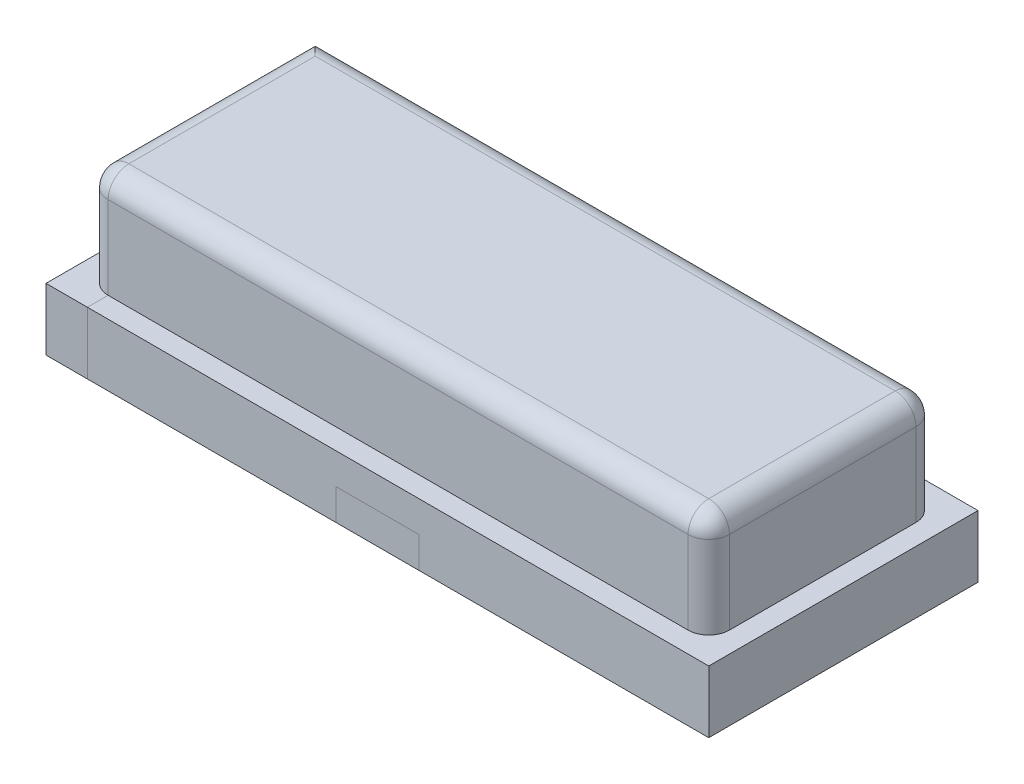
ISO-10303-21;
HEADER;
FILE_DESCRIPTION(('STEP AP214'),'2;1');
FILE_NAME('part.step','',(''),(''),'','','');
FILE_SCHEMA(('AUTOMOTIVE_DESIGN { 1 0 10303 214 1 1 1 1 }'));
ENDSEC;
DATA;
#1=APPLICATION_CONTEXT('core data for automotive mechanical design processes');
#2=APPLICATION_PROTOCOL_DEFINITION('international standard','automotive_design',2000,#1);
#3=PRODUCT_CONTEXT('',#1,'mechanical');
#4=PRODUCT('Part','Part','',(#3));
#5=PRODUCT_RELATED_PRODUCT_CATEGORY('part','',(#4));
#6=PRODUCT_DEFINITION_FORMATION('','',#4);
#7=PRODUCT_DEFINITION_CONTEXT('part definition',#1,'design');
#8=PRODUCT_DEFINITION('design','',#6,#7);
#9=PRODUCT_DEFINITION_SHAPE('','',#8);
#10=(LENGTH_UNIT() NAMED_UNIT(*) SI_UNIT(.MILLI.,.METRE.));
#11=(NAMED_UNIT(*) PLANE_ANGLE_UNIT() SI_UNIT($,.RADIAN.));
#12=(NAMED_UNIT(*) SI_UNIT($,.STERADIAN.) SOLID_ANGLE_UNIT());
#13=UNCERTAINTY_MEASURE_WITH_UNIT(LENGTH_MEASURE(1.E-05),#10,'distance_accuracy_value','');
#14=(GEOMETRIC_REPRESENTATION_CONTEXT(3) GLOBAL_UNCERTAINTY_ASSIGNED_CONTEXT((#13)) GLOBAL_UNIT_ASSIGNED_CONTEXT((#10,
#11,#12)) REPRESENTATION_CONTEXT('',''));
#15=CARTESIAN_POINT('',(0.,0.,0.));
#16=DIRECTION('',(0.,0.,1.));
#17=DIRECTION('',(1.,0.,0.));
#18=AXIS2_PLACEMENT_3D('',#15,#16,#17);
#19=CARTESIAN_POINT('',(0.,0.35,0.));
#20=DIRECTION('',(0.,1.,0.));
#21=DIRECTION('',(0.,0.,1.));
#22=AXIS2_PLACEMENT_3D('',#19,#20,#21);
#23=PLANE('',#22);
#24=DIRECTION('',(1.,0.,0.));
#25=VECTOR('',#24,1.);
#26=CARTESIAN_POINT('',(0.,0.35,-0.65));
#27=LINE('',#26,#25);
#28=CARTESIAN_POINT('',(0.2,0.35,-0.65));
#29=VERTEX_POINT('',#28);
#30=CARTESIAN_POINT('',(-0.2,0.35,-0.65));
#31=VERTEX_POINT('',#30);
#32=EDGE_CURVE('P0_E237',#29,#31,#27,.F.);
#33=ORIENTED_EDGE('',*,*,#32,.F.);
#34=DIRECTION('',(0.,0.,-1.));
#35=VECTOR('',#34,1.);
#36=CARTESIAN_POINT('',(0.2,0.35,-0.65));
#37=LINE('',#36,#35);
#38=CARTESIAN_POINT('',(0.2,0.35,0.65));
#39=VERTEX_POINT('',#38);
#40=EDGE_CURVE('P0_E219',#29,#39,#37,.F.);
#41=ORIENTED_EDGE('',*,*,#40,.T.);
#42=DIRECTION('',(1.,0.,0.));
#43=VECTOR('',#42,1.);
#44=CARTESIAN_POINT('',(0.,0.35,0.65));
#45=LINE('',#44,#43);
#46=CARTESIAN_POINT('',(-0.2,0.35,0.65));
#47=VERTEX_POINT('',#46);
#48=EDGE_CURVE('P0_E240',#47,#39,#45,.T.);
#49=ORIENTED_EDGE('',*,*,#48,.F.);
#50=DIRECTION('',(0.,0.,1.));
#51=VECTOR('',#50,1.);
#52=CARTESIAN_POINT('',(-0.2,0.35,-0.65));
#53=LINE('',#52,#51);
#54=EDGE_CURVE('P0_E230',#47,#31,#53,.F.);
#55=ORIENTED_EDGE('',*,*,#54,.T.);
#56=EDGE_LOOP('',(#33,#41,#49,#55));
#57=FACE_BOUND('',#56,.T.);
#58=ADVANCED_FACE('P0_F16',(#57),#23,.F.);
#59=CARTESIAN_POINT('',(-0.2,1.76014705087354,-0.65));
#60=DIRECTION('',(-1.,0.,0.));
#61=DIRECTION('',(0.,0.,1.));
#62=AXIS2_PLACEMENT_3D('',#59,#60,#61);
#63=PLANE('',#62);
#64=DIRECTION('',(0.,0.,1.));
#65=VECTOR('',#64,1.);
#66=CARTESIAN_POINT('',(-0.2,0.2,-0.65));
#67=LINE('',#66,#65);
#68=CARTESIAN_POINT('',(-0.2,0.2,0.65));
#69=VERTEX_POINT('',#68);
#70=CARTESIAN_POINT('',(-0.2,0.2,-0.65));
#71=VERTEX_POINT('',#70);
#72=EDGE_CURVE('P0_E183',#69,#71,#67,.F.);
#73=ORIENTED_EDGE('',*,*,#72,.T.);
#74=DIRECTION('',(0.,1.,0.));
#75=VECTOR('',#74,1.);
#76=CARTESIAN_POINT('',(-0.2,1.76014705087354,-0.65));
#77=LINE('',#76,#75);
#78=EDGE_CURVE('P0_E225',#31,#71,#77,.F.);
#79=ORIENTED_EDGE('',*,*,#78,.F.);
#80=ORIENTED_EDGE('',*,*,#54,.F.);
#81=DIRECTION('',(0.,1.,0.));
#82=VECTOR('',#81,1.);
#83=CARTESIAN_POINT('',(-0.2,1.76014705087354,0.65));
#84=LINE('',#83,#82);
#85=EDGE_CURVE('P0_E222',#69,#47,#84,.T.);
#86=ORIENTED_EDGE('',*,*,#85,.F.);
#87=EDGE_LOOP('',(#73,#79,#80,#86));
#88=FACE_BOUND('',#87,.T.);
#89=ADVANCED_FACE('P0_F261',(#88),#63,.F.);
#90=CARTESIAN_POINT('',(0.2,1.76014705087354,-0.65));
#91=DIRECTION('',(1.,0.,0.));
#92=DIRECTION('',(0.,0.,-1.));
#93=AXIS2_PLACEMENT_3D('',#90,#91,#92);
#94=PLANE('',#93);
#95=DIRECTION('',(0.,0.,1.));
#96=VECTOR('',#95,1.);
#97=CARTESIAN_POINT('',(0.2,0.2,-0.65));
#98=LINE('',#97,#96);
#99=CARTESIAN_POINT('',(0.2,0.2,-0.65));
#100=VERTEX_POINT('',#99);
#101=CARTESIAN_POINT('',(0.2,0.2,0.65));
#102=VERTEX_POINT('',#101);
#103=EDGE_CURVE('P0_E180',#100,#102,#98,.T.);
#104=ORIENTED_EDGE('',*,*,#103,.T.);
#105=DIRECTION('',(0.,1.,0.));
#106=VECTOR('',#105,1.);
#107=CARTESIAN_POINT('',(0.2,1.76014705087354,0.65));
#108=LINE('',#107,#106);
#109=EDGE_CURVE('P0_E214',#39,#102,#108,.F.);
#110=ORIENTED_EDGE('',*,*,#109,.F.);
#111=ORIENTED_EDGE('',*,*,#40,.F.);
#112=DIRECTION('',(0.,1.,0.));
#113=VECTOR('',#112,1.);
#114=CARTESIAN_POINT('',(0.2,1.76014705087354,-0.65));
#115=LINE('',#114,#113);
#116=EDGE_CURVE('P0_E205',#100,#29,#115,.T.);
#117=ORIENTED_EDGE('',*,*,#116,.F.);
#118=EDGE_LOOP('',(#104,#110,#111,#117));
#119=FACE_BOUND('',#118,.T.);
#120=ADVANCED_FACE('P0_F308',(#119),#94,.F.);
#121=CARTESIAN_POINT('',(-1.6,0.2,-0.65));
#122=DIRECTION('',(0.,1.,0.));
#123=DIRECTION('',(0.,0.,1.));
#124=AXIS2_PLACEMENT_3D('',#121,#122,#123);
#125=PLANE('',#124);
#126=ORIENTED_EDGE('',*,*,#72,.F.);
#127=DIRECTION('',(-1.,0.,0.));
#128=VECTOR('',#127,1.);
#129=CARTESIAN_POINT('',(-1.6,0.2,0.65));
#130=LINE('',#129,#128);
#131=CARTESIAN_POINT('',(-1.4,0.2,0.65));
#132=VERTEX_POINT('',#131);
#133=EDGE_CURVE('P0_E192',#69,#132,#130,.T.);
#134=ORIENTED_EDGE('',*,*,#133,.T.);
#135=DIRECTION('',(0.,0.,1.));
#136=VECTOR('',#135,1.);
#137=CARTESIAN_POINT('',(-1.4,0.2,-0.65));
#138=LINE('',#137,#136);
#139=CARTESIAN_POINT('',(-1.4,0.2,-0.65));
#140=VERTEX_POINT('',#139);
#141=EDGE_CURVE('P0_E156',#140,#132,#138,.T.);
#142=ORIENTED_EDGE('',*,*,#141,.F.);
#143=DIRECTION('',(1.,0.,0.));
#144=VECTOR('',#143,1.);
#145=CARTESIAN_POINT('',(-1.6,0.2,-0.65));
#146=LINE('',#145,#144);
#147=EDGE_CURVE('P0_E141',#140,#71,#146,.T.);
#148=ORIENTED_EDGE('',*,*,#147,.T.);
#149=EDGE_LOOP('',(#126,#134,#142,#148));
#150=FACE_BOUND('',#149,.T.);
#151=ADVANCED_FACE('P0_F275',(#150),#125,.F.);
#152=CARTESIAN_POINT('',(-1.6,0.2,-0.65));
#153=DIRECTION('',(0.,1.,0.));
#154=DIRECTION('',(0.,0.,1.));
#155=AXIS2_PLACEMENT_3D('',#152,#153,#154);
#156=PLANE('',#155);
#157=DIRECTION('',(-1.,0.,0.));
#158=VECTOR('',#157,1.);
#159=CARTESIAN_POINT('',(-1.6,0.2,0.65));
#160=LINE('',#159,#158);
#161=CARTESIAN_POINT('',(1.6,0.2,0.65));
#162=VERTEX_POINT('',#161);
#163=EDGE_CURVE('P0_E162',#162,#102,#160,.T.);
#164=ORIENTED_EDGE('',*,*,#163,.T.);
#165=ORIENTED_EDGE('',*,*,#103,.F.);
#166=DIRECTION('',(1.,0.,0.));
#167=VECTOR('',#166,1.);
#168=CARTESIAN_POINT('',(-1.6,0.2,-0.65));
#169=LINE('',#168,#167);
#170=CARTESIAN_POINT('',(1.6,0.2,-0.65));
#171=VERTEX_POINT('',#170);
#172=EDGE_CURVE('P0_E168',#100,#171,#169,.T.);
#173=ORIENTED_EDGE('',*,*,#172,.T.);
#174=DIRECTION('',(0.,0.,1.));
#175=VECTOR('',#174,1.);
#176=CARTESIAN_POINT('',(1.6,0.2,0.65));
#177=LINE('',#176,#175);
#178=EDGE_CURVE('P0_E173',#171,#162,#177,.T.);
#179=ORIENTED_EDGE('',*,*,#178,.T.);
#180=EDGE_LOOP('',(#164,#165,#173,#179));
#181=FACE_BOUND('',#180,.T.);
#182=ADVANCED_FACE('P0_F310',(#181),#156,.F.);
#183=CARTESIAN_POINT('',(1.6,0.4,0.65));
#184=DIRECTION('',(-1.,0.,0.));
#185=DIRECTION('',(0.,0.,1.));
#186=AXIS2_PLACEMENT_3D('',#183,#184,#185);
#187=PLANE('',#186);
#188=ORIENTED_EDGE('',*,*,#178,.F.);
#189=DIRECTION('',(0.,1.,0.));
#190=VECTOR('',#189,1.);
#191=CARTESIAN_POINT('',(1.6,0.4,-0.65));
#192=LINE('',#191,#190);
#193=CARTESIAN_POINT('',(1.6,0.5,-0.65));
#194=VERTEX_POINT('',#193);
#195=EDGE_CURVE('P0_E159',#171,#194,#192,.T.);
#196=ORIENTED_EDGE('',*,*,#195,.T.);
#197=DIRECTION('',(0.,0.,-1.));
#198=VECTOR('',#197,1.);
#199=CARTESIAN_POINT('',(1.6,0.5,0.));
#200=LINE('',#199,#198);
#201=CARTESIAN_POINT('',(1.6,0.5,0.65));
#202=VERTEX_POINT('',#201);
#203=EDGE_CURVE('P0_E131',#194,#202,#200,.F.);
#204=ORIENTED_EDGE('',*,*,#203,.T.);
#205=DIRECTION('',(0.,1.,0.));
#206=VECTOR('',#205,1.);
#207=CARTESIAN_POINT('',(1.6,0.4,0.65));
#208=LINE('',#207,#206);
#209=EDGE_CURVE('P0_E163',#202,#162,#208,.F.);
#210=ORIENTED_EDGE('',*,*,#209,.T.);
#211=EDGE_LOOP('',(#188,#196,#204,#210));
#212=FACE_BOUND('',#211,.T.);
#213=ADVANCED_FACE('P0_F315',(#212),#187,.F.);
#214=CARTESIAN_POINT('',(-1.6,0.4,0.65));
#215=DIRECTION('',(0.,0.,-1.));
#216=DIRECTION('',(-1.,0.,0.));
#217=AXIS2_PLACEMENT_3D('',#214,#215,#216);
#218=PLANE('',#217);
#219=DIRECTION('',(1.,0.,0.));
#220=VECTOR('',#219,1.);
#221=CARTESIAN_POINT('',(0.,0.5,0.65));
#222=LINE('',#221,#220);
#223=CARTESIAN_POINT('',(-1.4,0.5,0.65));
#224=VERTEX_POINT('',#223);
#225=EDGE_CURVE('P0_E81',#202,#224,#222,.F.);
#226=ORIENTED_EDGE('',*,*,#225,.T.);
#227=DIRECTION('',(0.,1.,0.));
#228=VECTOR('',#227,1.);
#229=CARTESIAN_POINT('',(-1.4,0.4,0.65));
#230=LINE('',#229,#228);
#231=EDGE_CURVE('P0_E147',#132,#224,#230,.T.);
#232=ORIENTED_EDGE('',*,*,#231,.F.);
#233=ORIENTED_EDGE('',*,*,#133,.F.);
#234=ORIENTED_EDGE('',*,*,#85,.T.);
#235=ORIENTED_EDGE('',*,*,#48,.T.);
#236=ORIENTED_EDGE('',*,*,#109,.T.);
#237=ORIENTED_EDGE('',*,*,#163,.F.);
#238=ORIENTED_EDGE('',*,*,#209,.F.);
#239=EDGE_LOOP('',(#226,#232,#233,#234,#235,#236,#237,#238));
#240=FACE_BOUND('',#239,.T.);
#241=ADVANCED_FACE('P0_F266',(#240),#218,.F.);
#242=CARTESIAN_POINT('',(-1.4,0.4,-0.65));
#243=DIRECTION('',(-1.,0.,0.));
#244=DIRECTION('',(0.,0.,1.));
#245=AXIS2_PLACEMENT_3D('',#242,#243,#244);
#246=PLANE('',#245);
#247=DIRECTION('',(0.,0.,1.));
#248=VECTOR('',#247,1.);
#249=CARTESIAN_POINT('',(-1.4,0.5,-0.65));
#250=LINE('',#249,#248);
#251=CARTESIAN_POINT('',(-1.4,0.5,-0.55));
#252=VERTEX_POINT('',#251);
#253=CARTESIAN_POINT('',(-1.4,0.5,-0.65));
#254=VERTEX_POINT('',#253);
#255=EDGE_CURVE('P0_E142',#252,#254,#250,.F.);
#256=ORIENTED_EDGE('',*,*,#255,.T.);
#257=DIRECTION('',(0.,1.,0.));
#258=VECTOR('',#257,1.);
#259=CARTESIAN_POINT('',(-1.4,0.4,-0.65));
#260=LINE('',#259,#258);
#261=EDGE_CURVE('P0_E138',#254,#140,#260,.F.);
#262=ORIENTED_EDGE('',*,*,#261,.T.);
#263=ORIENTED_EDGE('',*,*,#141,.T.);
#264=ORIENTED_EDGE('',*,*,#231,.T.);
#265=DIRECTION('',(0.,0.,-1.));
#266=VECTOR('',#265,1.);
#267=CARTESIAN_POINT('',(-1.4,0.5,0.));
#268=LINE('',#267,#266);
#269=CARTESIAN_POINT('',(-1.4,0.5,0.55));
#270=VERTEX_POINT('',#269);
#271=EDGE_CURVE('P0_E129',#224,#270,#268,.T.);
#272=ORIENTED_EDGE('',*,*,#271,.T.);
#273=DIRECTION('',(0.,0.,-1.));
#274=VECTOR('',#273,1.);
#275=CARTESIAN_POINT('',(-1.4,0.5,0.));
#276=LINE('',#275,#274);
#277=EDGE_CURVE('P0_E80',#252,#270,#276,.F.);
#278=ORIENTED_EDGE('',*,*,#277,.F.);
#279=EDGE_LOOP('',(#256,#262,#263,#264,#272,#278));
#280=FACE_BOUND('',#279,.T.);
#281=ADVANCED_FACE('P0_F317',(#280),#246,.T.);
#282=CARTESIAN_POINT('',(-1.6,0.4,-0.65));
#283=DIRECTION('',(0.,0.,1.));
#284=DIRECTION('',(1.,0.,0.));
#285=AXIS2_PLACEMENT_3D('',#282,#283,#284);
#286=PLANE('',#285);
#287=ORIENTED_EDGE('',*,*,#195,.F.);
#288=ORIENTED_EDGE('',*,*,#172,.F.);
#289=ORIENTED_EDGE('',*,*,#116,.T.);
#290=ORIENTED_EDGE('',*,*,#32,.T.);
#291=ORIENTED_EDGE('',*,*,#78,.T.);
#292=ORIENTED_EDGE('',*,*,#147,.F.);
#293=ORIENTED_EDGE('',*,*,#261,.F.);
#294=DIRECTION('',(1.,0.,0.));
#295=VECTOR('',#294,1.);
#296=CARTESIAN_POINT('',(0.,0.5,-0.65));
#297=LINE('',#296,#295);
#298=EDGE_CURVE('P0_E104',#254,#194,#297,.T.);
#299=ORIENTED_EDGE('',*,*,#298,.T.);
#300=EDGE_LOOP('',(#287,#288,#289,#290,#291,#292,#293,#299));
#301=FACE_BOUND('',#300,.T.);
#302=ADVANCED_FACE('P0_F303',(#301),#286,.F.);
#303=CARTESIAN_POINT('',(1.4,1.,0.45));
#304=DIRECTION('',(0.,1.,0.));
#305=DIRECTION('',(0.,0.,1.));
#306=AXIS2_PLACEMENT_3D('',#303,#304,#305);
#307=CYLINDRICAL_SURFACE('',#306,0.1);
#308=CARTESIAN_POINT('',(1.4,0.9,0.45));
#309=DIRECTION('',(0.,-1.,0.));
#310=DIRECTION('',(1.,0.,0.));
#311=AXIS2_PLACEMENT_3D('',#308,#309,#310);
#312=CIRCLE('',#311,0.1);
#313=CARTESIAN_POINT('',(1.4,0.9,0.55));
#314=VERTEX_POINT('',#313);
#315=CARTESIAN_POINT('',(1.5,0.9,0.45));
#316=VERTEX_POINT('',#315);
#317=EDGE_CURVE('P0_E91',#314,#316,#312,.F.);
#318=ORIENTED_EDGE('',*,*,#317,.F.);
#319=DIRECTION('',(0.,1.,0.));
#320=VECTOR('',#319,1.);
#321=CARTESIAN_POINT('',(1.4,1.,0.55));
#322=LINE('',#321,#320);
#323=CARTESIAN_POINT('',(1.4,0.5,0.55));
#324=VERTEX_POINT('',#323);
#325=EDGE_CURVE('P0_E86',#314,#324,#322,.F.);
#326=ORIENTED_EDGE('',*,*,#325,.T.);
#327=CARTESIAN_POINT('',(1.4,0.5,0.45));
#328=DIRECTION('',(0.,1.,0.));
#329=DIRECTION('',(0.,0.,1.));
#330=AXIS2_PLACEMENT_3D('',#327,#328,#329);
#331=CIRCLE('',#330,0.1);
#332=CARTESIAN_POINT('',(1.5,0.5,0.45));
#333=VERTEX_POINT('',#332);
#334=EDGE_CURVE('P0_E19',#324,#333,#331,.T.);
#335=ORIENTED_EDGE('',*,*,#334,.T.);
#336=DIRECTION('',(0.,1.,0.));
#337=VECTOR('',#336,1.);
#338=CARTESIAN_POINT('',(1.5,1.,0.45));
#339=LINE('',#338,#337);
#340=EDGE_CURVE('P0_E103',#333,#316,#339,.T.);
#341=ORIENTED_EDGE('',*,*,#340,.T.);
#342=EDGE_LOOP('',(#318,#326,#335,#341));
#343=FACE_BOUND('',#342,.T.);
#344=ADVANCED_FACE('P0_F94',(#343),#307,.T.);
#345=CARTESIAN_POINT('',(-1.4,1.,0.45));
#346=DIRECTION('',(0.,-1.,0.));
#347=DIRECTION('',(0.,0.,-1.));
#348=AXIS2_PLACEMENT_3D('',#345,#346,#347);
#349=CYLINDRICAL_SURFACE('',#348,0.1);
#350=CARTESIAN_POINT('',(-1.4,0.9,0.45));
#351=DIRECTION('',(0.,-1.,-7.66618956496172E-12));
#352=DIRECTION('',(1.,0.,0.));
#353=AXIS2_PLACEMENT_3D('',#350,#351,#352);
#354=CIRCLE('',#353,0.1);
#355=CARTESIAN_POINT('',(-1.5,0.9,0.45));
#356=VERTEX_POINT('',#355);
#357=CARTESIAN_POINT('',(-1.4,0.899999999999809,0.55));
#358=VERTEX_POINT('',#357);
#359=EDGE_CURVE('P0_E324',#356,#358,#354,.F.);
#360=ORIENTED_EDGE('',*,*,#359,.F.);
#361=DIRECTION('',(0.,1.,0.));
#362=VECTOR('',#361,1.);
#363=CARTESIAN_POINT('',(-1.5,1.,0.45));
#364=LINE('',#363,#362);
#365=CARTESIAN_POINT('',(-1.5,0.5,0.45));
#366=VERTEX_POINT('',#365);
#367=EDGE_CURVE('P0_E124',#356,#366,#364,.F.);
#368=ORIENTED_EDGE('',*,*,#367,.T.);
#369=CARTESIAN_POINT('',(-1.4,0.5,0.45));
#370=DIRECTION('',(0.,-1.,0.));
#371=DIRECTION('',(0.,0.,-1.));
#372=AXIS2_PLACEMENT_3D('',#369,#370,#371);
#373=CIRCLE('',#372,0.1);
#374=EDGE_CURVE('P0_E105',#270,#366,#373,.T.);
#375=ORIENTED_EDGE('',*,*,#374,.F.);
#376=DIRECTION('',(0.,1.,0.));
#377=VECTOR('',#376,1.);
#378=CARTESIAN_POINT('',(-1.4,1.,0.55));
#379=LINE('',#378,#377);
#380=EDGE_CURVE('P0_E89',#270,#358,#379,.T.);
#381=ORIENTED_EDGE('',*,*,#380,.T.);
#382=EDGE_LOOP('',(#360,#368,#375,#381));
#383=FACE_BOUND('',#382,.T.);
#384=ADVANCED_FACE('P0_F321',(#383),#349,.T.);
#385=CARTESIAN_POINT('',(0.,0.5,0.));
#386=DIRECTION('',(0.,-1.,0.));
#387=DIRECTION('',(0.,0.,-1.));
#388=AXIS2_PLACEMENT_3D('',#385,#386,#387);
#389=PLANE('',#388);
#390=DIRECTION('',(0.,0.,-1.));
#391=VECTOR('',#390,1.);
#392=CARTESIAN_POINT('',(-1.5,0.5,0.4));
#393=LINE('',#392,#391);
#394=CARTESIAN_POINT('',(-1.5,0.5,-0.55));
#395=VERTEX_POINT('',#394);
#396=EDGE_CURVE('P0_E121',#366,#395,#393,.T.);
#397=ORIENTED_EDGE('',*,*,#396,.T.);
#398=DIRECTION('',(1.,0.,0.));
#399=VECTOR('',#398,1.);
#400=CARTESIAN_POINT('',(1.35,0.5,-0.55));
#401=LINE('',#400,#399);
#402=EDGE_CURVE('P0_E384',#395,#252,#401,.T.);
#403=ORIENTED_EDGE('',*,*,#402,.T.);
#404=ORIENTED_EDGE('',*,*,#277,.T.);
#405=ORIENTED_EDGE('',*,*,#374,.T.);
#406=EDGE_LOOP('',(#397,#403,#404,#405));
#407=FACE_BOUND('',#406,.T.);
#408=ADVANCED_FACE('P0_F597',(#407),#389,.T.);
#409=CARTESIAN_POINT('',(0.,0.5,0.));
#410=DIRECTION('',(0.,-1.,0.));
#411=DIRECTION('',(0.,0.,-1.));
#412=AXIS2_PLACEMENT_3D('',#409,#410,#411);
#413=PLANE('',#412);
#414=ORIENTED_EDGE('',*,*,#298,.F.);
#415=ORIENTED_EDGE('',*,*,#255,.F.);
#416=DIRECTION('',(1.,0.,0.));
#417=VECTOR('',#416,1.);
#418=CARTESIAN_POINT('',(1.35,0.5,-0.55));
#419=LINE('',#418,#417);
#420=CARTESIAN_POINT('',(1.4,0.5,-0.55));
#421=VERTEX_POINT('',#420);
#422=EDGE_CURVE('P0_E380',#252,#421,#419,.T.);
#423=ORIENTED_EDGE('',*,*,#422,.T.);
#424=CARTESIAN_POINT('',(1.4,0.5,-0.45));
#425=DIRECTION('',(0.,1.,0.));
#426=DIRECTION('',(0.,0.,1.));
#427=AXIS2_PLACEMENT_3D('',#424,#425,#426);
#428=CIRCLE('',#427,0.1);
#429=CARTESIAN_POINT('',(1.5,0.5,-0.45));
#430=VERTEX_POINT('',#429);
#431=EDGE_CURVE('P0_E102',#430,#421,#428,.T.);
#432=ORIENTED_EDGE('',*,*,#431,.F.);
#433=DIRECTION('',(0.,0.,1.));
#434=VECTOR('',#433,1.);
#435=CARTESIAN_POINT('',(1.5,0.5,0.4));
#436=LINE('',#435,#434);
#437=EDGE_CURVE('P0_E75',#430,#333,#436,.T.);
#438=ORIENTED_EDGE('',*,*,#437,.T.);
#439=ORIENTED_EDGE('',*,*,#334,.F.);
#440=DIRECTION('',(-1.,0.,0.));
#441=VECTOR('',#440,1.);
#442=CARTESIAN_POINT('',(1.35,0.5,0.55));
#443=LINE('',#442,#441);
#444=EDGE_CURVE('P0_E72',#324,#270,#443,.T.);
#445=ORIENTED_EDGE('',*,*,#444,.T.);
#446=ORIENTED_EDGE('',*,*,#271,.F.);
#447=ORIENTED_EDGE('',*,*,#225,.F.);
#448=ORIENTED_EDGE('',*,*,#203,.F.);
#449=EDGE_LOOP('',(#414,#415,#423,#432,#438,#439,#445,#446,#447,#448));
#450=FACE_BOUND('',#449,.T.);
#451=ADVANCED_FACE('P0_F70',(#450),#413,.F.);
#452=CARTESIAN_POINT('',(1.4,1.,-0.45));
#453=DIRECTION('',(0.,1.,0.));
#454=DIRECTION('',(0.,0.,1.));
#455=AXIS2_PLACEMENT_3D('',#452,#453,#454);
#456=CYLINDRICAL_SURFACE('',#455,0.1);
#457=CARTESIAN_POINT('',(1.4,0.9,-0.45));
#458=DIRECTION('',(0.,1.,0.));
#459=DIRECTION('',(1.,0.,0.));
#460=AXIS2_PLACEMENT_3D('',#457,#458,#459);
#461=CIRCLE('',#460,0.1);
#462=CARTESIAN_POINT('',(1.5,0.9,-0.45));
#463=VERTEX_POINT('',#462);
#464=CARTESIAN_POINT('',(1.4,0.9,-0.55));
#465=VERTEX_POINT('',#464);
#466=EDGE_CURVE('P0_E123',#463,#465,#461,.T.);
#467=ORIENTED_EDGE('',*,*,#466,.F.);
#468=DIRECTION('',(0.,1.,0.));
#469=VECTOR('',#468,1.);
#470=CARTESIAN_POINT('',(1.5,1.,-0.45));
#471=LINE('',#470,#469);
#472=EDGE_CURVE('P0_E134',#463,#430,#471,.F.);
#473=ORIENTED_EDGE('',*,*,#472,.T.);
#474=ORIENTED_EDGE('',*,*,#431,.T.);
#475=DIRECTION('',(0.,-1.,0.));
#476=VECTOR('',#475,1.);
#477=CARTESIAN_POINT('',(1.4,1.,-0.55));
#478=LINE('',#477,#476);
#479=EDGE_CURVE('P0_E383',#421,#465,#478,.F.);
#480=ORIENTED_EDGE('',*,*,#479,.T.);
#481=EDGE_LOOP('',(#467,#473,#474,#480));
#482=FACE_BOUND('',#481,.T.);
#483=ADVANCED_FACE('P0_F474',(#482),#456,.T.);
#484=CARTESIAN_POINT('',(1.5,1.,0.4));
#485=DIRECTION('',(-1.,0.,0.));
#486=DIRECTION('',(0.,0.,1.));
#487=AXIS2_PLACEMENT_3D('',#484,#485,#486);
#488=PLANE('',#487);
#489=ORIENTED_EDGE('',*,*,#472,.F.);
#490=DIRECTION('',(0.,0.,-1.));
#491=VECTOR('',#490,1.);
#492=CARTESIAN_POINT('',(1.5,0.9,0.4));
#493=LINE('',#492,#491);
#494=EDGE_CURVE('P0_E366',#316,#463,#493,.T.);
#495=ORIENTED_EDGE('',*,*,#494,.F.);
#496=ORIENTED_EDGE('',*,*,#340,.F.);
#497=ORIENTED_EDGE('',*,*,#437,.F.);
#498=EDGE_LOOP('',(#489,#495,#496,#497));
#499=FACE_BOUND('',#498,.T.);
#500=ADVANCED_FACE('P0_F471',(#499),#488,.F.);
#501=CARTESIAN_POINT('',(1.35,1.,0.55));
#502=DIRECTION('',(0.,0.,-1.));
#503=DIRECTION('',(-1.,0.,0.));
#504=AXIS2_PLACEMENT_3D('',#501,#502,#503);
#505=PLANE('',#504);
#506=ORIENTED_EDGE('',*,*,#325,.F.);
#507=DIRECTION('',(-1.,0.,0.));
#508=VECTOR('',#507,1.);
#509=CARTESIAN_POINT('',(1.35,0.9,0.55));
#510=LINE('',#509,#508);
#511=EDGE_CURVE('P0_E358',#358,#314,#510,.F.);
#512=ORIENTED_EDGE('',*,*,#511,.F.);
#513=ORIENTED_EDGE('',*,*,#380,.F.);
#514=ORIENTED_EDGE('',*,*,#444,.F.);
#515=EDGE_LOOP('',(#506,#512,#513,#514));
#516=FACE_BOUND('',#515,.T.);
#517=ADVANCED_FACE('P0_F84',(#516),#505,.F.);
#518=CARTESIAN_POINT('',(1.4,0.9,0.45));
#519=DIRECTION('',(1.,0.,0.));
#520=DIRECTION('',(0.,0.,-1.));
#521=AXIS2_PLACEMENT_3D('',#518,#519,#520);
#522=SPHERICAL_SURFACE('',#521,0.1);
#523=ORIENTED_EDGE('',*,*,#317,.T.);
#524=CARTESIAN_POINT('',(1.4,0.9,0.45));
#525=DIRECTION('',(0.,0.,-1.));
#526=DIRECTION('',(-1.,0.,0.));
#527=AXIS2_PLACEMENT_3D('',#524,#525,#526);
#528=CIRCLE('',#527,0.1);
#529=CARTESIAN_POINT('',(1.4,1.,0.45));
#530=VERTEX_POINT('',#529);
#531=EDGE_CURVE('P0_E370',#530,#316,#528,.T.);
#532=ORIENTED_EDGE('',*,*,#531,.F.);
#533=CARTESIAN_POINT('',(1.4,0.9,0.45));
#534=DIRECTION('',(-1.,0.,0.));
#535=DIRECTION('',(0.,0.,1.));
#536=AXIS2_PLACEMENT_3D('',#533,#534,#535);
#537=CIRCLE('',#536,0.1);
#538=EDGE_CURVE('P0_E360',#314,#530,#537,.T.);
#539=ORIENTED_EDGE('',*,*,#538,.F.);
#540=EDGE_LOOP('',(#523,#532,#539));
#541=FACE_BOUND('',#540,.T.);
#542=ADVANCED_FACE('P0_F344',(#541),#522,.T.);
#543=CARTESIAN_POINT('',(-1.4,0.9,0.45));
#544=DIRECTION('',(1.,0.,0.));
#545=DIRECTION('',(0.,0.,-1.));
#546=AXIS2_PLACEMENT_3D('',#543,#544,#545);
#547=SPHERICAL_SURFACE('',#546,0.1);
#548=CARTESIAN_POINT('',(-1.4,0.9,0.45));
#549=DIRECTION('',(-1.,0.,0.));
#550=DIRECTION('',(0.,0.,1.));
#551=AXIS2_PLACEMENT_3D('',#548,#549,#550);
#552=CIRCLE('',#551,0.1);
#553=CARTESIAN_POINT('',(-1.4,1.,0.45));
#554=VERTEX_POINT('',#553);
#555=EDGE_CURVE('P0_E361',#554,#358,#552,.F.);
#556=ORIENTED_EDGE('',*,*,#555,.F.);
#557=CARTESIAN_POINT('',(-1.4,0.9,0.45));
#558=DIRECTION('',(0.,0.,-1.));
#559=DIRECTION('',(-1.,0.,0.));
#560=AXIS2_PLACEMENT_3D('',#557,#558,#559);
#561=CIRCLE('',#560,0.1);
#562=EDGE_CURVE('P0_E458',#356,#554,#561,.T.);
#563=ORIENTED_EDGE('',*,*,#562,.F.);
#564=ORIENTED_EDGE('',*,*,#359,.T.);
#565=EDGE_LOOP('',(#556,#563,#564));
#566=FACE_BOUND('',#565,.T.);
#567=ADVANCED_FACE('P0_F339',(#566),#547,.T.);
#568=CARTESIAN_POINT('',(-1.5,1.,0.4));
#569=DIRECTION('',(1.,0.,0.));
#570=DIRECTION('',(0.,0.,-1.));
#571=AXIS2_PLACEMENT_3D('',#568,#569,#570);
#572=PLANE('',#571);
#573=ORIENTED_EDGE('',*,*,#367,.F.);
#574=DIRECTION('',(0.,0.,-1.));
#575=VECTOR('',#574,1.);
#576=CARTESIAN_POINT('',(-1.5,0.9,0.4));
#577=LINE('',#576,#575);
#578=CARTESIAN_POINT('',(-1.5,0.9,-0.55));
#579=VERTEX_POINT('',#578);
#580=EDGE_CURVE('P0_E504',#579,#356,#577,.F.);
#581=ORIENTED_EDGE('',*,*,#580,.F.);
#582=DIRECTION('',(0.,-1.,0.));
#583=VECTOR('',#582,1.);
#584=CARTESIAN_POINT('',(-1.5,1.,-0.55));
#585=LINE('',#584,#583);
#586=EDGE_CURVE('P0_E386',#579,#395,#585,.T.);
#587=ORIENTED_EDGE('',*,*,#586,.T.);
#588=ORIENTED_EDGE('',*,*,#396,.F.);
#589=EDGE_LOOP('',(#573,#581,#587,#588));
#590=FACE_BOUND('',#589,.T.);
#591=ADVANCED_FACE('P0_F343',(#590),#572,.F.);
#592=CARTESIAN_POINT('',(1.4,0.9,-0.45));
#593=DIRECTION('',(1.,0.,0.));
#594=DIRECTION('',(0.,0.,-1.));
#595=AXIS2_PLACEMENT_3D('',#592,#593,#594);
#596=SPHERICAL_SURFACE('',#595,0.1);
#597=CARTESIAN_POINT('',(1.4,0.9,-0.45));
#598=DIRECTION('',(0.,0.,-1.));
#599=DIRECTION('',(-1.,0.,0.));
#600=AXIS2_PLACEMENT_3D('',#597,#598,#599);
#601=CIRCLE('',#600,0.1);
#602=CARTESIAN_POINT('',(1.4,1.,-0.45));
#603=VERTEX_POINT('',#602);
#604=EDGE_CURVE('P0_E369',#463,#603,#601,.F.);
#605=ORIENTED_EDGE('',*,*,#604,.F.);
#606=ORIENTED_EDGE('',*,*,#466,.T.);
#607=CARTESIAN_POINT('',(1.4,0.9,-0.45));
#608=DIRECTION('',(-1.,0.,0.));
#609=DIRECTION('',(0.,0.,1.));
#610=AXIS2_PLACEMENT_3D('',#607,#608,#609);
#611=CIRCLE('',#610,0.1);
#612=EDGE_CURVE('P0_E482',#603,#465,#611,.T.);
#613=ORIENTED_EDGE('',*,*,#612,.F.);
#614=EDGE_LOOP('',(#605,#606,#613));
#615=FACE_BOUND('',#614,.T.);
#616=ADVANCED_FACE('P0_F403',(#615),#596,.T.);
#617=CARTESIAN_POINT('',(1.35,1.,-0.55));
#618=DIRECTION('',(0.,0.,1.));
#619=DIRECTION('',(0.,-1.,0.));
#620=AXIS2_PLACEMENT_3D('',#617,#618,#619);
#621=PLANE('',#620);
#622=ORIENTED_EDGE('',*,*,#479,.F.);
#623=ORIENTED_EDGE('',*,*,#422,.F.);
#624=ORIENTED_EDGE('',*,*,#402,.F.);
#625=ORIENTED_EDGE('',*,*,#586,.F.);
#626=DIRECTION('',(-1.,0.,0.));
#627=VECTOR('',#626,1.);
#628=CARTESIAN_POINT('',(-1.35,0.9,-0.55));
#629=LINE('',#628,#627);
#630=EDGE_CURVE('P0_E446',#465,#579,#629,.T.);
#631=ORIENTED_EDGE('',*,*,#630,.F.);
#632=EDGE_LOOP('',(#622,#623,#624,#625,#631));
#633=FACE_BOUND('',#632,.T.);
#634=ADVANCED_FACE('P0_F406',(#633),#621,.F.);
#635=CARTESIAN_POINT('',(1.4,0.9,0.4));
#636=DIRECTION('',(0.,0.,-1.));
#637=DIRECTION('',(-1.,0.,0.));
#638=AXIS2_PLACEMENT_3D('',#635,#636,#637);
#639=CYLINDRICAL_SURFACE('',#638,0.1);
#640=ORIENTED_EDGE('',*,*,#604,.T.);
#641=DIRECTION('',(0.,0.,-1.));
#642=VECTOR('',#641,1.);
#643=CARTESIAN_POINT('',(1.4,1.,0.4));
#644=LINE('',#643,#642);
#645=EDGE_CURVE('P0_E444',#603,#530,#644,.F.);
#646=ORIENTED_EDGE('',*,*,#645,.T.);
#647=ORIENTED_EDGE('',*,*,#531,.T.);
#648=ORIENTED_EDGE('',*,*,#494,.T.);
#649=EDGE_LOOP('',(#640,#646,#647,#648));
#650=FACE_BOUND('',#649,.T.);
#651=ADVANCED_FACE('P0_F410',(#650),#639,.T.);
#652=CARTESIAN_POINT('',(1.35,0.9,0.45));
#653=DIRECTION('',(-1.,0.,0.));
#654=DIRECTION('',(0.,0.,1.));
#655=AXIS2_PLACEMENT_3D('',#652,#653,#654);
#656=CYLINDRICAL_SURFACE('',#655,0.1);
#657=ORIENTED_EDGE('',*,*,#538,.T.);
#658=DIRECTION('',(1.,0.,0.));
#659=VECTOR('',#658,1.);
#660=CARTESIAN_POINT('',(-1.35,1.,0.45));
#661=LINE('',#660,#659);
#662=EDGE_CURVE('P0_E437',#530,#554,#661,.F.);
#663=ORIENTED_EDGE('',*,*,#662,.T.);
#664=ORIENTED_EDGE('',*,*,#555,.T.);
#665=ORIENTED_EDGE('',*,*,#511,.T.);
#666=EDGE_LOOP('',(#657,#663,#664,#665));
#667=FACE_BOUND('',#666,.T.);
#668=ADVANCED_FACE('P0_F414',(#667),#656,.T.);
#669=CARTESIAN_POINT('',(-1.4,0.9,0.4));
#670=DIRECTION('',(0.,0.,-1.));
#671=DIRECTION('',(-1.,0.,0.));
#672=AXIS2_PLACEMENT_3D('',#669,#670,#671);
#673=CYLINDRICAL_SURFACE('',#672,0.1);
#674=CARTESIAN_POINT('',(-1.4,0.9,-0.45));
#675=DIRECTION('',(-0.707106781186547,0.,0.707106781186547));
#676=DIRECTION('',(-0.707106781186547,0.,-0.707106781186547));
#677=AXIS2_PLACEMENT_3D('',#674,#675,#676);
#678=ELLIPSE('',#677,0.14142135623731,0.1);
#679=CARTESIAN_POINT('',(-1.4,1.,-0.45));
#680=VERTEX_POINT('',#679);
#681=EDGE_CURVE('P0_E33',#579,#680,#678,.F.);
#682=ORIENTED_EDGE('',*,*,#681,.F.);
#683=ORIENTED_EDGE('',*,*,#580,.T.);
#684=ORIENTED_EDGE('',*,*,#562,.T.);
#685=DIRECTION('',(0.,0.,-1.));
#686=VECTOR('',#685,1.);
#687=CARTESIAN_POINT('',(-1.4,1.,0.4));
#688=LINE('',#687,#686);
#689=EDGE_CURVE('P0_E25',#554,#680,#688,.T.);
#690=ORIENTED_EDGE('',*,*,#689,.T.);
#691=EDGE_LOOP('',(#682,#683,#684,#690));
#692=FACE_BOUND('',#691,.T.);
#693=ADVANCED_FACE('P0_F418',(#692),#673,.T.);
#694=CARTESIAN_POINT('',(-1.35,0.9,-0.45));
#695=DIRECTION('',(-1.,0.,0.));
#696=DIRECTION('',(0.,0.,1.));
#697=AXIS2_PLACEMENT_3D('',#694,#695,#696);
#698=CYLINDRICAL_SURFACE('',#697,0.1);
#699=ORIENTED_EDGE('',*,*,#612,.T.);
#700=ORIENTED_EDGE('',*,*,#630,.T.);
#701=ORIENTED_EDGE('',*,*,#681,.T.);
#702=DIRECTION('',(1.,0.,0.));
#703=VECTOR('',#702,1.);
#704=CARTESIAN_POINT('',(-1.35,1.,-0.45));
#705=LINE('',#704,#703);
#706=EDGE_CURVE('P0_E11',#680,#603,#705,.T.);
#707=ORIENTED_EDGE('',*,*,#706,.T.);
#708=EDGE_LOOP('',(#699,#700,#701,#707));
#709=FACE_BOUND('',#708,.T.);
#710=ADVANCED_FACE('P0_F422',(#709),#698,.T.);
#711=CARTESIAN_POINT('',(-1.35,1.,0.4));
#712=DIRECTION('',(0.,-1.,0.));
#713=DIRECTION('',(0.,0.,-1.));
#714=AXIS2_PLACEMENT_3D('',#711,#712,#713);
#715=PLANE('',#714);
#716=ORIENTED_EDGE('',*,*,#689,.F.);
#717=ORIENTED_EDGE('',*,*,#662,.F.);
#718=ORIENTED_EDGE('',*,*,#645,.F.);
#719=ORIENTED_EDGE('',*,*,#706,.F.);
#720=EDGE_LOOP('',(#716,#717,#718,#719));
#721=FACE_BOUND('',#720,.T.);
#722=ADVANCED_FACE('P0_F426',(#721),#715,.F.);
#723=CLOSED_SHELL('',(#58,#89,#120,#151,#182,#213,#241,#281,#302,#344,#384,#408,#451,#483,#500,
#517,#542,#567,#591,#616,#634,#651,#668,#693,#710,#722));
#724=MANIFOLD_SOLID_BREP('P0_B1',#723);
#725=CARTESIAN_POINT('',(-1.4,1.76014705087354,-0.65));
#726=DIRECTION('',(-1.,0.,0.));
#727=DIRECTION('',(0.,0.,1.));
#728=AXIS2_PLACEMENT_3D('',#725,#726,#727);
#729=PLANE('',#728);
#730=DIRECTION('',(0.,0.,1.));
#731=VECTOR('',#730,1.);
#732=CARTESIAN_POINT('',(-1.4,0.2,-0.65));
#733=LINE('',#732,#731);
#734=CARTESIAN_POINT('',(-1.4,0.2,0.65));
#735=VERTEX_POINT('',#734);
#736=CARTESIAN_POINT('',(-1.4,0.2,-0.65));
#737=VERTEX_POINT('',#736);
#738=EDGE_CURVE('P1_E52',#735,#737,#733,.F.);
#739=ORIENTED_EDGE('',*,*,#738,.T.);
#740=DIRECTION('',(0.,1.,0.));
#741=VECTOR('',#740,1.);
#742=CARTESIAN_POINT('',(-1.4,1.76014705087354,-0.65));
#743=LINE('',#742,#741);
#744=CARTESIAN_POINT('',(-1.4,0.5,-0.65));
#745=VERTEX_POINT('',#744);
#746=EDGE_CURVE('P1_E19',#745,#737,#743,.F.);
#747=ORIENTED_EDGE('',*,*,#746,.F.);
#748=DIRECTION('',(0.,0.,-1.));
#749=VECTOR('',#748,1.);
#750=CARTESIAN_POINT('',(-1.4,0.5,0.));
#751=LINE('',#750,#749);
#752=CARTESIAN_POINT('',(-1.4,0.5,0.65));
#753=VERTEX_POINT('',#752);
#754=EDGE_CURVE('P1_E57',#745,#753,#751,.F.);
#755=ORIENTED_EDGE('',*,*,#754,.T.);
#756=DIRECTION('',(0.,1.,0.));
#757=VECTOR('',#756,1.);
#758=CARTESIAN_POINT('',(-1.4,0.4,0.65));
#759=LINE('',#758,#757);
#760=EDGE_CURVE('P1_E59',#753,#735,#759,.F.);
#761=ORIENTED_EDGE('',*,*,#760,.T.);
#762=EDGE_LOOP('',(#739,#747,#755,#761));
#763=FACE_BOUND('',#762,.T.);
#764=ADVANCED_FACE('P1_F16',(#763),#729,.F.);
#765=CARTESIAN_POINT('',(0.,0.5,0.));
#766=DIRECTION('',(0.,-1.,0.));
#767=DIRECTION('',(0.,0.,-1.));
#768=AXIS2_PLACEMENT_3D('',#765,#766,#767);
#769=PLANE('',#768);
#770=DIRECTION('',(1.,0.,0.));
#771=VECTOR('',#770,1.);
#772=CARTESIAN_POINT('',(-1.6,0.5,-0.65));
#773=LINE('',#772,#771);
#774=CARTESIAN_POINT('',(-1.6,0.5,-0.65));
#775=VERTEX_POINT('',#774);
#776=EDGE_CURVE('P1_E79',#745,#775,#773,.F.);
#777=ORIENTED_EDGE('',*,*,#776,.T.);
#778=DIRECTION('',(0.,0.,-1.));
#779=VECTOR('',#778,1.);
#780=CARTESIAN_POINT('',(-1.6,0.5,0.65));
#781=LINE('',#780,#779);
#782=CARTESIAN_POINT('',(-1.6,0.5,0.65));
#783=VERTEX_POINT('',#782);
#784=EDGE_CURVE('P1_E74',#775,#783,#781,.F.);
#785=ORIENTED_EDGE('',*,*,#784,.T.);
#786=DIRECTION('',(-1.,0.,0.));
#787=VECTOR('',#786,1.);
#788=CARTESIAN_POINT('',(-1.6,0.5,0.65));
#789=LINE('',#788,#787);
#790=EDGE_CURVE('P1_E65',#783,#753,#789,.F.);
#791=ORIENTED_EDGE('',*,*,#790,.T.);
#792=ORIENTED_EDGE('',*,*,#754,.F.);
#793=EDGE_LOOP('',(#777,#785,#791,#792));
#794=FACE_BOUND('',#793,.T.);
#795=ADVANCED_FACE('P1_F73',(#794),#769,.F.);
#796=CARTESIAN_POINT('',(-1.6,0.4,0.65));
#797=DIRECTION('',(0.,0.,-1.));
#798=DIRECTION('',(-1.,0.,0.));
#799=AXIS2_PLACEMENT_3D('',#796,#797,#798);
#800=PLANE('',#799);
#801=DIRECTION('',(1.,0.,0.));
#802=VECTOR('',#801,1.);
#803=CARTESIAN_POINT('',(-1.6,0.2,0.65));
#804=LINE('',#803,#802);
#805=CARTESIAN_POINT('',(-1.6,0.2,0.65));
#806=VERTEX_POINT('',#805);
#807=EDGE_CURVE('P1_E70',#806,#735,#804,.T.);
#808=ORIENTED_EDGE('',*,*,#807,.T.);
#809=ORIENTED_EDGE('',*,*,#760,.F.);
#810=ORIENTED_EDGE('',*,*,#790,.F.);
#811=DIRECTION('',(0.,1.,0.));
#812=VECTOR('',#811,1.);
#813=CARTESIAN_POINT('',(-1.6,0.4,0.65));
#814=LINE('',#813,#812);
#815=EDGE_CURVE('P1_E83',#783,#806,#814,.F.);
#816=ORIENTED_EDGE('',*,*,#815,.T.);
#817=EDGE_LOOP('',(#808,#809,#810,#816));
#818=FACE_BOUND('',#817,.T.);
#819=ADVANCED_FACE('P1_F67',(#818),#800,.F.);
#820=CARTESIAN_POINT('',(-1.6,0.2,-0.65));
#821=DIRECTION('',(0.,1.,0.));
#822=DIRECTION('',(0.,0.,1.));
#823=AXIS2_PLACEMENT_3D('',#820,#821,#822);
#824=PLANE('',#823);
#825=DIRECTION('',(0.,0.,-1.));
#826=VECTOR('',#825,1.);
#827=CARTESIAN_POINT('',(-1.6,0.2,0.65));
#828=LINE('',#827,#826);
#829=CARTESIAN_POINT('',(-1.6,0.2,-0.65));
#830=VERTEX_POINT('',#829);
#831=EDGE_CURVE('P1_E25',#806,#830,#828,.T.);
#832=ORIENTED_EDGE('',*,*,#831,.T.);
#833=DIRECTION('',(1.,0.,0.));
#834=VECTOR('',#833,1.);
#835=CARTESIAN_POINT('',(-1.6,0.2,-0.65));
#836=LINE('',#835,#834);
#837=EDGE_CURVE('P1_E33',#830,#737,#836,.T.);
#838=ORIENTED_EDGE('',*,*,#837,.T.);
#839=ORIENTED_EDGE('',*,*,#738,.F.);
#840=ORIENTED_EDGE('',*,*,#807,.F.);
#841=EDGE_LOOP('',(#832,#838,#839,#840));
#842=FACE_BOUND('',#841,.T.);
#843=ADVANCED_FACE('P1_F87',(#842),#824,.F.);
#844=CARTESIAN_POINT('',(-1.6,0.4,-0.65));
#845=DIRECTION('',(0.,0.,1.));
#846=DIRECTION('',(1.,0.,0.));
#847=AXIS2_PLACEMENT_3D('',#844,#845,#846);
#848=PLANE('',#847);
#849=ORIENTED_EDGE('',*,*,#837,.F.);
#850=DIRECTION('',(0.,1.,0.));
#851=VECTOR('',#850,1.);
#852=CARTESIAN_POINT('',(-1.6,0.4,-0.65));
#853=LINE('',#852,#851);
#854=EDGE_CURVE('P1_E11',#830,#775,#853,.T.);
#855=ORIENTED_EDGE('',*,*,#854,.T.);
#856=ORIENTED_EDGE('',*,*,#776,.F.);
#857=ORIENTED_EDGE('',*,*,#746,.T.);
#858=EDGE_LOOP('',(#849,#855,#856,#857));
#859=FACE_BOUND('',#858,.T.);
#860=ADVANCED_FACE('P1_F90',(#859),#848,.F.);
#861=CARTESIAN_POINT('',(-1.6,0.4,0.65));
#862=DIRECTION('',(1.,0.,0.));
#863=DIRECTION('',(0.,0.,-1.));
#864=AXIS2_PLACEMENT_3D('',#861,#862,#863);
#865=PLANE('',#864);
#866=ORIENTED_EDGE('',*,*,#831,.F.);
#867=ORIENTED_EDGE('',*,*,#815,.F.);
#868=ORIENTED_EDGE('',*,*,#784,.F.);
#869=ORIENTED_EDGE('',*,*,#854,.F.);
#870=EDGE_LOOP('',(#866,#867,#868,#869));
#871=FACE_BOUND('',#870,.T.);
#872=ADVANCED_FACE('P1_F89',(#871),#865,.F.);
#873=CLOSED_SHELL('',(#764,#795,#819,#843,#860,#872));
#874=MANIFOLD_SOLID_BREP('P1_B1',#873);
#875=CARTESIAN_POINT('',(0.,0.35,0.));
#876=DIRECTION('',(0.,1.,0.));
#877=DIRECTION('',(0.,0.,1.));
#878=AXIS2_PLACEMENT_3D('',#875,#876,#877);
#879=PLANE('',#878);
#880=DIRECTION('',(1.,0.,0.));
#881=VECTOR('',#880,1.);
#882=CARTESIAN_POINT('',(-0.2,0.35,0.65));
#883=LINE('',#882,#881);
#884=CARTESIAN_POINT('',(0.2,0.35,0.65));
#885=VERTEX_POINT('',#884);
#886=CARTESIAN_POINT('',(-0.2,0.35,0.65));
#887=VERTEX_POINT('',#886);
#888=EDGE_CURVE('P2_E52',#885,#887,#883,.F.);
#889=ORIENTED_EDGE('',*,*,#888,.F.);
#890=DIRECTION('',(0.,0.,-1.));
#891=VECTOR('',#890,1.);
#892=CARTESIAN_POINT('',(0.2,0.35,-0.65));
#893=LINE('',#892,#891);
#894=CARTESIAN_POINT('',(0.2,0.35,-0.65));
#895=VERTEX_POINT('',#894);
#896=EDGE_CURVE('P2_E67',#895,#885,#893,.F.);
#897=ORIENTED_EDGE('',*,*,#896,.F.);
#898=DIRECTION('',(-1.,0.,0.));
#899=VECTOR('',#898,1.);
#900=CARTESIAN_POINT('',(-0.2,0.35,-0.65));
#901=LINE('',#900,#899);
#902=CARTESIAN_POINT('',(-0.2,0.35,-0.65));
#903=VERTEX_POINT('',#902);
#904=EDGE_CURVE('P2_E19',#903,#895,#901,.F.);
#905=ORIENTED_EDGE('',*,*,#904,.F.);
#906=DIRECTION('',(0.,0.,1.));
#907=VECTOR('',#906,1.);
#908=CARTESIAN_POINT('',(-0.2,0.35,-0.65));
#909=LINE('',#908,#907);
#910=EDGE_CURVE('P2_E57',#887,#903,#909,.F.);
#911=ORIENTED_EDGE('',*,*,#910,.F.);
#912=EDGE_LOOP('',(#889,#897,#905,#911));
#913=FACE_BOUND('',#912,.T.);
#914=ADVANCED_FACE('P2_F16',(#913),#879,.T.);
#915=CARTESIAN_POINT('',(-0.2,0.4,-0.65));
#916=DIRECTION('',(0.,0.,-1.));
#917=DIRECTION('',(-1.,0.,0.));
#918=AXIS2_PLACEMENT_3D('',#915,#916,#917);
#919=PLANE('',#918);
#920=ORIENTED_EDGE('',*,*,#904,.T.);
#921=DIRECTION('',(0.,1.,0.));
#922=VECTOR('',#921,1.);
#923=CARTESIAN_POINT('',(0.2,0.4,-0.65));
#924=LINE('',#923,#922);
#925=CARTESIAN_POINT('',(0.2,0.2,-0.65));
#926=VERTEX_POINT('',#925);
#927=EDGE_CURVE('P2_E78',#926,#895,#924,.T.);
#928=ORIENTED_EDGE('',*,*,#927,.F.);
#929=DIRECTION('',(1.,0.,0.));
#930=VECTOR('',#929,1.);
#931=CARTESIAN_POINT('',(-1.6,0.2,-0.65));
#932=LINE('',#931,#930);
#933=CARTESIAN_POINT('',(-0.2,0.2,-0.65));
#934=VERTEX_POINT('',#933);
#935=EDGE_CURVE('P2_E73',#926,#934,#932,.F.);
#936=ORIENTED_EDGE('',*,*,#935,.T.);
#937=DIRECTION('',(0.,1.,0.));
#938=VECTOR('',#937,1.);
#939=CARTESIAN_POINT('',(-0.2,0.4,-0.65));
#940=LINE('',#939,#938);
#941=EDGE_CURVE('P2_E62',#903,#934,#940,.F.);
#942=ORIENTED_EDGE('',*,*,#941,.F.);
#943=EDGE_LOOP('',(#920,#928,#936,#942));
#944=FACE_BOUND('',#943,.T.);
#945=ADVANCED_FACE('P2_F72',(#944),#919,.T.);
#946=CARTESIAN_POINT('',(-0.2,0.4,-0.65));
#947=DIRECTION('',(-1.,0.,0.));
#948=DIRECTION('',(0.,0.,1.));
#949=AXIS2_PLACEMENT_3D('',#946,#947,#948);
#950=PLANE('',#949);
#951=ORIENTED_EDGE('',*,*,#910,.T.);
#952=ORIENTED_EDGE('',*,*,#941,.T.);
#953=DIRECTION('',(0.,0.,1.));
#954=VECTOR('',#953,1.);
#955=CARTESIAN_POINT('',(-0.2,0.2,-0.65));
#956=LINE('',#955,#954);
#957=CARTESIAN_POINT('',(-0.2,0.2,0.65));
#958=VERTEX_POINT('',#957);
#959=EDGE_CURVE('P2_E83',#934,#958,#956,.T.);
#960=ORIENTED_EDGE('',*,*,#959,.T.);
#961=DIRECTION('',(0.,1.,0.));
#962=VECTOR('',#961,1.);
#963=CARTESIAN_POINT('',(-0.2,0.4,0.65));
#964=LINE('',#963,#962);
#965=EDGE_CURVE('P2_E64',#887,#958,#964,.F.);
#966=ORIENTED_EDGE('',*,*,#965,.F.);
#967=EDGE_LOOP('',(#951,#952,#960,#966));
#968=FACE_BOUND('',#967,.T.);
#969=ADVANCED_FACE('P2_F59',(#968),#950,.T.);
#970=CARTESIAN_POINT('',(-0.2,0.4,0.65));
#971=DIRECTION('',(0.,0.,1.));
#972=DIRECTION('',(1.,0.,0.));
#973=AXIS2_PLACEMENT_3D('',#970,#971,#972);
#974=PLANE('',#973);
#975=ORIENTED_EDGE('',*,*,#888,.T.);
#976=ORIENTED_EDGE('',*,*,#965,.T.);
#977=DIRECTION('',(1.,0.,0.));
#978=VECTOR('',#977,1.);
#979=CARTESIAN_POINT('',(-1.6,0.2,0.65));
#980=LINE('',#979,#978);
#981=CARTESIAN_POINT('',(0.2,0.2,0.65));
#982=VERTEX_POINT('',#981);
#983=EDGE_CURVE('P2_E25',#958,#982,#980,.T.);
#984=ORIENTED_EDGE('',*,*,#983,.T.);
#985=DIRECTION('',(0.,1.,0.));
#986=VECTOR('',#985,1.);
#987=CARTESIAN_POINT('',(0.2,0.4,0.65));
#988=LINE('',#987,#986);
#989=EDGE_CURVE('P2_E33',#885,#982,#988,.F.);
#990=ORIENTED_EDGE('',*,*,#989,.F.);
#991=EDGE_LOOP('',(#975,#976,#984,#990));
#992=FACE_BOUND('',#991,.T.);
#993=ADVANCED_FACE('P2_F87',(#992),#974,.T.);
#994=CARTESIAN_POINT('',(0.2,0.4,-0.65));
#995=DIRECTION('',(1.,0.,0.));
#996=DIRECTION('',(0.,0.,-1.));
#997=AXIS2_PLACEMENT_3D('',#994,#995,#996);
#998=PLANE('',#997);
#999=ORIENTED_EDGE('',*,*,#896,.T.);
#1000=ORIENTED_EDGE('',*,*,#989,.T.);
#1001=DIRECTION('',(0.,0.,1.));
#1002=VECTOR('',#1001,1.);
#1003=CARTESIAN_POINT('',(0.2,0.2,-0.65));
#1004=LINE('',#1003,#1002);
#1005=EDGE_CURVE('P2_E11',#982,#926,#1004,.F.);
#1006=ORIENTED_EDGE('',*,*,#1005,.T.);
#1007=ORIENTED_EDGE('',*,*,#927,.T.);
#1008=EDGE_LOOP('',(#999,#1000,#1006,#1007));
#1009=FACE_BOUND('',#1008,.T.);
#1010=ADVANCED_FACE('P2_F90',(#1009),#998,.T.);
#1011=CARTESIAN_POINT('',(-1.6,0.2,-0.65));
#1012=DIRECTION('',(0.,1.,0.));
#1013=DIRECTION('',(0.,0.,1.));
#1014=AXIS2_PLACEMENT_3D('',#1011,#1012,#1013);
#1015=PLANE('',#1014);
#1016=ORIENTED_EDGE('',*,*,#983,.F.);
#1017=ORIENTED_EDGE('',*,*,#959,.F.);
#1018=ORIENTED_EDGE('',*,*,#935,.F.);
#1019=ORIENTED_EDGE('',*,*,#1005,.F.);
#1020=EDGE_LOOP('',(#1016,#1017,#1018,#1019));
#1021=FACE_BOUND('',#1020,.T.);
#1022=ADVANCED_FACE('P2_F89',(#1021),#1015,.F.);
#1023=CLOSED_SHELL('',(#914,#945,#969,#993,#1010,#1022));
#1024=MANIFOLD_SOLID_BREP('P2_B1',#1023);
#1025=ADVANCED_BREP_SHAPE_REPRESENTATION('',(#18,#724,#874,#1024),#14);
#1026=SHAPE_DEFINITION_REPRESENTATION(#9,#1025);
ENDSEC;
END-ISO-10303-21;
